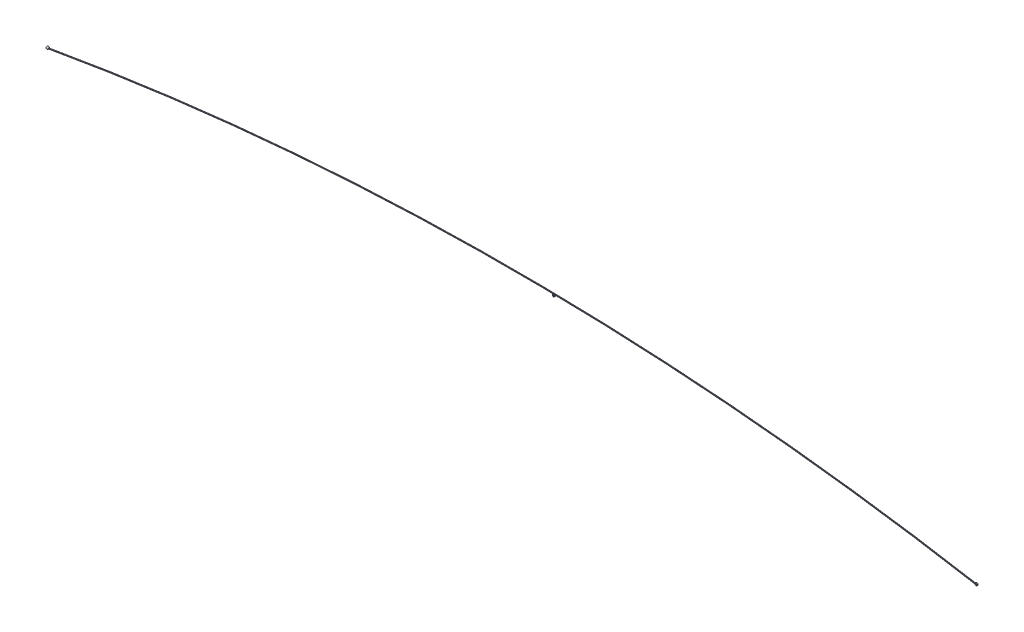
ISO-10303-21;
HEADER;
FILE_DESCRIPTION(('STEP AP214'),'2;1');
FILE_NAME('part.step','',(''),(''),'','','');
FILE_SCHEMA(('AUTOMOTIVE_DESIGN { 1 0 10303 214 1 1 1 1 }'));
ENDSEC;
DATA;
#1=APPLICATION_CONTEXT('core data for automotive mechanical design processes');
#2=APPLICATION_PROTOCOL_DEFINITION('international standard','automotive_design',2000,#1);
#3=PRODUCT_CONTEXT('',#1,'mechanical');
#4=PRODUCT('Part','Part','',(#3));
#5=PRODUCT_RELATED_PRODUCT_CATEGORY('part','',(#4));
#6=PRODUCT_DEFINITION_FORMATION('','',#4);
#7=PRODUCT_DEFINITION_CONTEXT('part definition',#1,'design');
#8=PRODUCT_DEFINITION('design','',#6,#7);
#9=PRODUCT_DEFINITION_SHAPE('','',#8);
#10=(LENGTH_UNIT() NAMED_UNIT(*) SI_UNIT(.MILLI.,.METRE.));
#11=(NAMED_UNIT(*) PLANE_ANGLE_UNIT() SI_UNIT($,.RADIAN.));
#12=(NAMED_UNIT(*) SI_UNIT($,.STERADIAN.) SOLID_ANGLE_UNIT());
#13=UNCERTAINTY_MEASURE_WITH_UNIT(LENGTH_MEASURE(1.E-05),#10,'distance_accuracy_value','');
#14=(GEOMETRIC_REPRESENTATION_CONTEXT(3) GLOBAL_UNCERTAINTY_ASSIGNED_CONTEXT((#13)) GLOBAL_UNIT_ASSIGNED_CONTEXT((#10,
#11,#12)) REPRESENTATION_CONTEXT('',''));
#15=CARTESIAN_POINT('',(0.,0.,0.));
#16=DIRECTION('',(0.,0.,1.));
#17=DIRECTION('',(1.,0.,0.));
#18=AXIS2_PLACEMENT_3D('',#15,#16,#17);
#19=CARTESIAN_POINT('',(-980.499968128505,0.249999999999931,0.));
#20=DIRECTION('',(-1.,0.,0.));
#21=DIRECTION('',(0.,1.,0.));
#22=AXIS2_PLACEMENT_3D('',#19,#20,#21);
#23=SPHERICAL_SURFACE('',#22,1.24999999999997);
#24=CARTESIAN_POINT('',(-979.333313507256,0.367970312867591,-0.433012701892127));
#25=CARTESIAN_POINT('',(-979.32279340934,0.389589827164613,-0.398787143895514));
#26=CARTESIAN_POINT('',(-979.314304843821,0.411198311139304,-0.363958308396999));
#27=CARTESIAN_POINT('',(-979.304664654527,0.443432433607916,-0.311077125512851));
#28=CARTESIAN_POINT('',(-979.301967253967,0.454142287172078,-0.293352384484927));
#29=CARTESIAN_POINT('',(-979.297607372539,0.475480770262388,-0.257726621940905));
#30=CARTESIAN_POINT('',(-979.295944891672,0.486109399788469,-0.239825600424665));
#31=CARTESIAN_POINT('',(-979.293659045764,0.507257910557459,-0.203893687296926));
#32=CARTESIAN_POINT('',(-979.293035680725,0.5177777918003,-0.185862795685349));
#33=CARTESIAN_POINT('',(-979.29282960963,0.538682180211832,-0.149716803664039));
#34=CARTESIAN_POINT('',(-979.293246903576,0.549066687380468,-0.131601703254272));
#35=CARTESIAN_POINT('',(-979.295159747355,0.570096808926977,-0.0945890319726686));
#36=CARTESIAN_POINT('',(-979.296698835523,0.580735654625824,-0.0756898523962937));
#37=CARTESIAN_POINT('',(-979.300904814248,0.601837993104418,-0.0378498560237225));
#38=CARTESIAN_POINT('',(-979.303574814279,0.612300919096736,-0.0189090687503537));
#39=CARTESIAN_POINT('',(-979.30680645399,0.622646237693473,0.));
#40=B_SPLINE_CURVE_WITH_KNOTS('',3,(#24,#25,#26,#27,#28,#29,#30,#31,#32,#33,#34,#35,#36,#37,#38,
#39),.UNSPECIFIED.,.F.,.F.,(4,2,2,2,2,2,2,4),(0.,0.125375075757954,0.188002652741953,
0.250630229776885,0.313257806850441,0.375885383949944,0.441082570118055,0.506460193592486),.UNSPECIFIED.);
#41=CARTESIAN_POINT('',(-979.333313507339,0.367970312853405,-0.433012701892219));
#42=VERTEX_POINT('',#41);
#43=CARTESIAN_POINT('',(-979.30680645399,0.622646237694236,0.));
#44=VERTEX_POINT('',#43);
#45=EDGE_CURVE('E218',#42,#44,#40,.T.);
#46=ORIENTED_EDGE('',*,*,#45,.F.);
#47=CARTESIAN_POINT('',(-980.499968128505,0.249999999999931,-0.433012701892219));
#48=DIRECTION('',(0.,0.,-1.));
#49=DIRECTION('',(-1.,0.,0.));
#50=AXIS2_PLACEMENT_3D('',#47,#48,#49);
#51=CIRCLE('',#50,1.17260393995583);
#52=CARTESIAN_POINT('',(-979.395164077457,-0.14294784519242,-0.433012701892219));
#53=VERTEX_POINT('',#52);
#54=EDGE_CURVE('E242',#53,#42,#51,.F.);
#55=ORIENTED_EDGE('',*,*,#54,.F.);
#56=CARTESIAN_POINT('',(-979.431919833581,-0.399440405049869,0.));
#57=CARTESIAN_POINT('',(-979.418784027979,-0.377846039543982,-0.0333787127993528));
#58=CARTESIAN_POINT('',(-979.408078854718,-0.356181057389514,-0.0676247826045807));
#59=CARTESIAN_POINT('',(-979.395752866956,-0.323817842424912,-0.119904948382628));
#60=CARTESIAN_POINT('',(-979.392267316339,-0.313060046315681,-0.137470761167597));
#61=CARTESIAN_POINT('',(-979.386547977937,-0.291621345049526,-0.172852767543568));
#62=CARTESIAN_POINT('',(-979.384314190142,-0.280940439891928,-0.190668961132376));
#63=CARTESIAN_POINT('',(-979.381106702527,-0.259696282307874,-0.22648364754626));
#64=CARTESIAN_POINT('',(-979.380133002699,-0.24913302988064,-0.244482140370132));
#65=CARTESIAN_POINT('',(-979.379449236784,-0.228163617700767,-0.280594176728098));
#66=CARTESIAN_POINT('',(-979.379739170692,-0.217757457947446,-0.298707720261691));
#67=CARTESIAN_POINT('',(-979.381642123985,-0.19646829344001,-0.336166116757573));
#68=CARTESIAN_POINT('',(-979.383340240212,-0.185598479373851,-0.355514193182297));
#69=CARTESIAN_POINT('',(-979.388171469161,-0.164081343464385,-0.394264606673515));
#70=CARTESIAN_POINT('',(-979.391310695887,-0.153435173744305,-0.413666821288893));
#71=CARTESIAN_POINT('',(-979.39516407758,-0.142947845214247,-0.43301270189222));
#72=B_SPLINE_CURVE_WITH_KNOTS('',3,(#56,#57,#58,#59,#60,#61,#62,#63,#64,#65,#66,#67,#68,#69,#70,
#71),.UNSPECIFIED.,.F.,.F.,(4,2,2,2,2,2,2,4),(0.,0.125451214406272,0.188088228690081,
0.250725242424663,0.313362255745273,0.375999268793365,0.442723343297771,0.509733153079345),.UNSPECIFIED.);
#73=CARTESIAN_POINT('',(-979.431919833581,-0.399440405049869,0.));
#74=VERTEX_POINT('',#73);
#75=EDGE_CURVE('E251',#74,#53,#72,.T.);
#76=ORIENTED_EDGE('',*,*,#75,.F.);
#77=CARTESIAN_POINT('',(-979.395164077581,-0.142947845214393,0.433012701892376));
#78=CARTESIAN_POINT('',(-979.391562426821,-0.15275073509811,0.414929474145294));
#79=CARTESIAN_POINT('',(-979.388584493591,-0.162692203524021,0.396797302588093));
#80=CARTESIAN_POINT('',(-979.383883510527,-0.182814373767124,0.36050304081111));
#81=CARTESIAN_POINT('',(-979.38216046069,-0.192995075583975,0.34234095059137));
#82=CARTESIAN_POINT('',(-979.379976692739,-0.213557788953609,0.306054820378091));
#83=CARTESIAN_POINT('',(-979.379515974626,-0.223939800506578,0.287930780384586));
#84=CARTESIAN_POINT('',(-979.379858325292,-0.244866094150746,0.251788827287639));
#85=CARTESIAN_POINT('',(-979.380661394077,-0.255410376242474,0.233770914184543));
#86=CARTESIAN_POINT('',(-979.383563319151,-0.276880386555465,0.197471400132062));
#87=CARTESIAN_POINT('',(-979.385693251004,-0.287809151121964,0.179194061265383));
#88=CARTESIAN_POINT('',(-979.391267848337,-0.309751958148249,0.142894528729484));
#89=CARTESIAN_POINT('',(-979.394712513829,-0.320766000608752,0.124872335062407));
#90=CARTESIAN_POINT('',(-979.407159242011,-0.354310977503485,0.0705821988423279));
#91=CARTESIAN_POINT('',(-979.418216198227,-0.376913433045617,0.034820095762965));
#92=CARTESIAN_POINT('',(-979.431919833584,-0.399440405051695,0.));
#93=B_SPLINE_CURVE_WITH_KNOTS('',3,(#77,#78,#79,#80,#81,#82,#83,#84,#85,#86,#87,#88,#89,#90,#91,
#92),.UNSPECIFIED.,.F.,.F.,(4,2,2,2,2,2,2,4),(0.,0.062637013001778,0.12527402591406,
0.187911038884388,0.25054805205944,0.314710241366923,0.378872431213442,0.509725306650627),.UNSPECIFIED.);
#94=CARTESIAN_POINT('',(-979.395164077581,-0.142947845214393,0.433012701892376));
#95=VERTEX_POINT('',#94);
#96=EDGE_CURVE('E253',#95,#74,#93,.T.);
#97=ORIENTED_EDGE('',*,*,#96,.F.);
#98=CARTESIAN_POINT('',(-980.499968128505,0.249999999999931,0.433012701892219));
#99=DIRECTION('',(0.,0.,1.));
#100=DIRECTION('',(1.,0.,0.));
#101=AXIS2_PLACEMENT_3D('',#98,#99,#100);
#102=CIRCLE('',#101,1.17260393995583);
#103=CARTESIAN_POINT('',(-979.333313507339,0.367970312853405,0.433012701892219));
#104=VERTEX_POINT('',#103);
#105=EDGE_CURVE('E255',#104,#95,#102,.F.);
#106=ORIENTED_EDGE('',*,*,#105,.F.);
#107=CARTESIAN_POINT('',(-979.30680645399,0.622646237694236,0.));
#108=CARTESIAN_POINT('',(-979.303710845033,0.612736121907413,0.0181135840697497));
#109=CARTESIAN_POINT('',(-979.301130526154,0.602718169004803,0.0362561568588424));
#110=CARTESIAN_POINT('',(-979.297004951607,0.582492417162171,0.0725531690273767));
#111=CARTESIAN_POINT('',(-979.295459695938,0.572284618222132,0.0907076084068194));
#112=CARTESIAN_POINT('',(-979.293408730865,0.551705002501813,0.126982242902313));
#113=CARTESIAN_POINT('',(-979.29290302146,0.541333185721551,0.145102438018369));
#114=CARTESIAN_POINT('',(-979.292932283582,0.520451975425859,0.181262428989015));
#115=CARTESIAN_POINT('',(-979.293467255108,0.509942581910475,0.199302224843631));
#116=CARTESIAN_POINT('',(-979.295592485336,0.488653156345019,0.235527410291851));
#117=CARTESIAN_POINT('',(-979.297198557324,0.477871433919119,0.253710884932842));
#118=CARTESIAN_POINT('',(-979.301477523962,0.456222370843983,0.289899395638271));
#119=CARTESIAN_POINT('',(-979.304150418612,0.445355030194813,0.307904431702847));
#120=CARTESIAN_POINT('',(-979.313841836668,0.412380660768063,0.36205213396971));
#121=CARTESIAN_POINT('',(-979.322505273682,0.390181592358491,0.397850383400429));
#122=CARTESIAN_POINT('',(-979.333313507257,0.36797031286782,0.433012701892219));
#123=B_SPLINE_CURVE_WITH_KNOTS('',3,(#107,#108,#109,#110,#111,#112,#113,#114,#115,#116,#117,
#118,#119,#120,#121,#122),.UNSPECIFIED.,.F.,.F.,(4,2,2,2,2,2,2,4),(0.,0.0626275771084987,
0.125255154222541,0.187882731329055,0.250510308415016,0.314083587676855,0.377656866889839,
0.5064568576761),.UNSPECIFIED.);
#124=EDGE_CURVE('E227',#44,#104,#123,.T.);
#125=ORIENTED_EDGE('',*,*,#124,.F.);
#126=EDGE_LOOP('',(#46,#55,#76,#97,#106,#125));
#127=FACE_BOUND('',#126,.T.);
#128=ADVANCED_FACE('F38',(#127),#23,.T.);
#129=CARTESIAN_POINT('',(-980.085852788761,0.23479629183987,-0.433012701892219));
#130=CARTESIAN_POINT('',(-655.077119848966,57.7959357665741,-0.433012701892219));
#131=CARTESIAN_POINT('',(-325.010518632569,57.8010559672835,-0.433012701892219));
#132=CARTESIAN_POINT('',(2.22044604925031E-13,0.250000000000195,-0.433012701892219));
#133=CARTESIAN_POINT('',(-980.171705577522,0.469592583680145,0.));
#134=CARTESIAN_POINT('',(-655.135395546844,58.0408155658653,0.));
#135=CARTESIAN_POINT('',(-325.039881416226,58.0510559672835,0.));
#136=CARTESIAN_POINT('',(1.11022302462516E-13,0.500000000000222,0.));
#137=(BOUNDED_SURFACE() B_SPLINE_SURFACE(1,3,((#129,#130,#131,#132),(#133,#134,#135,#136)),
.UNSPECIFIED.,.F.,.F.,.F.) B_SPLINE_SURFACE_WITH_KNOTS((2,2),(4,4),(0.,1.),(0.,1.),
.UNSPECIFIED.) GEOMETRIC_REPRESENTATION_ITEM() RATIONAL_B_SPLINE_SURFACE(((1.,0.98978594943853,
0.98978594943853,1.),(1.,0.98978594943853,0.98978594943853,1.))) REPRESENTATION_ITEM('') SURFACE());
#138=CARTESIAN_POINT('',(-0.216300692091165,0.288292605556517,-0.433012701892219));
#139=CARTESIAN_POINT('',(-0.21391882597524,0.298341394989262,-0.41487724666311));
#140=CARTESIAN_POINT('',(-0.211411255665442,0.308366116119425,-0.396744945766788));
#141=CARTESIAN_POINT('',(-0.206143844494259,0.328365646628616,-0.360489461659237));
#142=CARTESIAN_POINT('',(-0.203384003590703,0.3383404559993,-0.342366278449533));
#143=CARTESIAN_POINT('',(-0.197611189220388,0.358238386700885,-0.306131840760601));
#144=CARTESIAN_POINT('',(-0.194598215697193,0.368161508020261,-0.288020586284035));
#145=CARTESIAN_POINT('',(-0.188317872977835,0.387954167213147,-0.251812899972676));
#146=CARTESIAN_POINT('',(-0.185050503710147,0.397823705071591,-0.233716468142053));
#147=CARTESIAN_POINT('',(-0.178259781483699,0.417507206826605,-0.197541385770555));
#148=CARTESIAN_POINT('',(-0.174736428437274,0.427321170704143,-0.179462735235772));
#149=CARTESIAN_POINT('',(-0.167431880721843,0.4468913958786,-0.143326330204861));
#150=CARTESIAN_POINT('',(-0.163650685947738,0.456647657151998,-0.125268575717253));
#151=CARTESIAN_POINT('',(-0.151981568002994,0.485665106687137,-0.0714308340158127));
#152=CARTESIAN_POINT('',(-0.14371177866576,0.504838428891596,-0.0356859599875362));
#153=CARTESIAN_POINT('',(-0.134920305853428,0.523885387619836,0.));
#154=B_SPLINE_CURVE_WITH_KNOTS('',3,(#138,#139,#140,#141,#142,#143,#144,#145,#146,#147,#148,
#149,#150,#151,#152,#153),.UNSPECIFIED.,.F.,.F.,(4,2,2,2,2,2,2,4),(0.,0.0626088618955963,
0.125217734257266,0.187826620577726,0.250435524501083,0.313044449865433,0.375653400749815,
0.499831796241539),.UNSPECIFIED.);
#155=CARTESIAN_POINT('',(-0.216300691858573,0.288292605515217,-0.433012701892219));
#156=VERTEX_POINT('',#155);
#157=CARTESIAN_POINT('',(-0.134920305853603,0.523885387619494,0.));
#158=VERTEX_POINT('',#157);
#159=EDGE_CURVE('E192',#156,#158,#154,.T.);
#160=CARTESIAN_POINT('',(-490.,-2766.9477768834,-0.433012701892219));
#161=DIRECTION('',(0.,0.,-1.));
#162=DIRECTION('',(-0.174392499137077,0.984676218990143,0.));
#163=AXIS2_PLACEMENT_3D('',#160,#161,#162);
#164=CIRCLE('',#163,2810.24617006917);
#165=EDGE_CURVE('E226',#42,#156,#164,.T.);
#166=CARTESIAN_POINT('',(-490.,-2766.9477768834,0.));
#167=DIRECTION('',(0.,0.,-1.));
#168=DIRECTION('',(-0.174407771357053,0.984673514059491,0.));
#169=AXIS2_PLACEMENT_3D('',#166,#167,#168);
#170=CIRCLE('',#169,2810.49234081449);
#171=EDGE_CURVE('E233',#44,#158,#170,.T.);
#172=ORIENTED_EDGE('',*,*,#159,.F.);
#173=ORIENTED_EDGE('',*,*,#165,.F.);
#174=ORIENTED_EDGE('',*,*,#45,.T.);
#175=ORIENTED_EDGE('',*,*,#171,.T.);
#176=EDGE_LOOP('',(#172,#173,#174,#175));
#177=FACE_BOUND('',#176,.T.);
#178=ADVANCED_FACE('F200',(#177),#137,.T.);
#179=CARTESIAN_POINT('',(-980.171705577522,0.469592583680145,0.));
#180=CARTESIAN_POINT('',(-655.135395546844,58.0408155658653,0.));
#181=CARTESIAN_POINT('',(-325.039881416226,58.0510559672835,0.));
#182=CARTESIAN_POINT('',(1.11022302462516E-13,0.500000000000222,0.));
#183=CARTESIAN_POINT('',(-980.085852788761,0.23479629183987,0.433012701892219));
#184=CARTESIAN_POINT('',(-655.077119848966,57.7959357665741,0.433012701892219));
#185=CARTESIAN_POINT('',(-325.010518632569,57.8010559672835,0.433012701892219));
#186=CARTESIAN_POINT('',(2.22044604925031E-13,0.250000000000195,0.433012701892219));
#187=(BOUNDED_SURFACE() B_SPLINE_SURFACE(1,3,((#179,#180,#181,#182),(#183,#184,#185,#186)),
.UNSPECIFIED.,.F.,.F.,.F.) B_SPLINE_SURFACE_WITH_KNOTS((2,2),(4,4),(0.,1.),(0.,1.),
.UNSPECIFIED.) GEOMETRIC_REPRESENTATION_ITEM() RATIONAL_B_SPLINE_SURFACE(((1.,0.98978594943853,
0.98978594943853,1.),(1.,0.98978594943853,0.98978594943853,1.))) REPRESENTATION_ITEM('') SURFACE());
#188=CARTESIAN_POINT('',(-0.134920305853437,0.523885387619938,0.));
#189=CARTESIAN_POINT('',(-0.143785893550072,0.504677865703067,0.0359867888359038));
#190=CARTESIAN_POINT('',(-0.152121059764235,0.485341596715225,0.0720339410699167));
#191=CARTESIAN_POINT('',(-0.163842595286272,0.456158304513642,0.126175003745159));
#192=CARTESIAN_POINT('',(-0.167619461549544,0.446401045354904,0.144233159583827));
#193=CARTESIAN_POINT('',(-0.173091351771874,0.431722057591774,0.171335748683387));
#194=CARTESIAN_POINT('',(-0.174883067234592,0.426821916486979,0.180372434466379));
#195=CARTESIAN_POINT('',(-0.180161959062576,0.412100080499995,0.20749007092345));
#196=CARTESIAN_POINT('',(-0.183552824914396,0.402257117535038,0.225578333111946));
#197=CARTESIAN_POINT('',(-0.190079428234216,0.382516688610982,0.261771047205208));
#198=CARTESIAN_POINT('',(-0.193215165786651,0.372619222669921,0.279875499104615));
#199=CARTESIAN_POINT('',(-0.19923295176458,0.352771709742254,0.316097706937327));
#200=CARTESIAN_POINT('',(-0.202115000258638,0.342821662769861,0.334215462867035));
#201=CARTESIAN_POINT('',(-0.208958131334887,0.318049963942574,0.379219754773168));
#202=CARTESIAN_POINT('',(-0.212767588096373,0.303197812043211,0.406112638002045));
#203=CARTESIAN_POINT('',(-0.216300692091063,0.288292605557125,0.433012701892219));
#204=B_SPLINE_CURVE_WITH_KNOTS('',3,(#188,#189,#190,#191,#192,#193,#194,#195,#196,#197,#198,
#199,#200,#201,#202,#203),.UNSPECIFIED.,.F.,.F.,(4,2,2,2,2,2,2,4),(0.,0.125226050419562,
0.187835010278728,0.219139006984673,0.281747928118828,0.344356828532528,0.40696571202492,
0.499831169010449),.UNSPECIFIED.);
#205=CARTESIAN_POINT('',(-0.216300691858573,0.288292605515217,0.433012701892219));
#206=VERTEX_POINT('',#205);
#207=EDGE_CURVE('E64',#158,#206,#204,.T.);
#208=CARTESIAN_POINT('',(-490.,-2766.9477768834,0.433012701892219));
#209=DIRECTION('',(0.,0.,-1.));
#210=DIRECTION('',(-0.174392499137077,0.984676218990143,0.));
#211=AXIS2_PLACEMENT_3D('',#208,#209,#210);
#212=CIRCLE('',#211,2810.24617006917);
#213=EDGE_CURVE('E235',#104,#206,#212,.T.);
#214=ORIENTED_EDGE('',*,*,#207,.F.);
#215=ORIENTED_EDGE('',*,*,#171,.F.);
#216=ORIENTED_EDGE('',*,*,#124,.T.);
#217=ORIENTED_EDGE('',*,*,#213,.T.);
#218=EDGE_LOOP('',(#214,#215,#216,#217));
#219=FACE_BOUND('',#218,.T.);
#220=ADVANCED_FACE('F206',(#219),#187,.T.);
#221=CARTESIAN_POINT('',(-979.914147211239,-0.234796291840682,0.433012701892219));
#222=CARTESIAN_POINT('',(-654.96056845321,57.3061761679918,0.433012701892219));
#223=CARTESIAN_POINT('',(-324.951793065255,57.3010559672835,0.433012701892219));
#224=CARTESIAN_POINT('',(1.11022302462516E-13,-0.249999999999806,0.433012701892219));
#225=CARTESIAN_POINT('',(-979.828294422478,-0.469592583680957,0.));
#226=CARTESIAN_POINT('',(-654.902292755331,57.0612963687006,0.));
#227=CARTESIAN_POINT('',(-324.922430281598,57.0510559672835,0.));
#228=CARTESIAN_POINT('',(1.11022302462516E-13,-0.499999999999834,0.));
#229=(BOUNDED_SURFACE() B_SPLINE_SURFACE(1,3,((#221,#222,#223,#224),(#225,#226,#227,#228)),
.UNSPECIFIED.,.F.,.F.,.F.) B_SPLINE_SURFACE_WITH_KNOTS((2,2),(4,4),(0.,1.),(0.,1.),
.UNSPECIFIED.) GEOMETRIC_REPRESENTATION_ITEM() RATIONAL_B_SPLINE_SURFACE(((1.,0.98978594943853,
0.98978594943853,1.),(1.,0.98978594943853,0.98978594943853,1.))) REPRESENTATION_ITEM('') SURFACE());
#230=CARTESIAN_POINT('',(-444.682558537927,42.1943753976901,0.));
#231=CARTESIAN_POINT('',(-444.705462076301,42.211807053072,0.030008645347709));
#232=CARTESIAN_POINT('',(-444.729517043246,42.2288953146537,0.0593811356851823));
#233=CARTESIAN_POINT('',(-444.780573997614,42.2623602500474,0.116792332420969));
#234=CARTESIAN_POINT('',(-444.807613732769,42.2787229735588,0.144805451924142));
#235=CARTESIAN_POINT('',(-444.878589576154,42.3178899039398,0.211684608819008));
#236=CARTESIAN_POINT('',(-444.924318109252,42.3399271887806,0.249152040409667));
#237=CARTESIAN_POINT('',(-445.022814067818,42.3795033808737,0.315981424947008));
#238=CARTESIAN_POINT('',(-445.075522921524,42.3970765090899,0.345405179878039));
#239=CARTESIAN_POINT('',(-445.156819867998,42.4177816435258,0.37953739240956));
#240=CARTESIAN_POINT('',(-445.182785866517,42.4235484425816,0.388951164423665));
#241=CARTESIAN_POINT('',(-445.235845021399,42.4335104790458,0.404984399195873));
#242=CARTESIAN_POINT('',(-445.262937127484,42.4377071458705,0.411606404221794));
#243=CARTESIAN_POINT('',(-445.32481441808,42.445161621795,0.422985274553262));
#244=CARTESIAN_POINT('',(-445.359829589363,42.4479224111886,0.426861956439701));
#245=CARTESIAN_POINT('',(-445.430152305745,42.4504564113294,0.429354998971146));
#246=CARTESIAN_POINT('',(-445.465459832865,42.4502298044403,0.427971680713173));
#247=CARTESIAN_POINT('',(-445.535236142987,42.4468549932583,0.420092258134075));
#248=CARTESIAN_POINT('',(-445.569707102659,42.4437154543842,0.413611326944667));
#249=CARTESIAN_POINT('',(-445.637123412766,42.4348288403176,0.396107901879271));
#250=CARTESIAN_POINT('',(-445.6700673052,42.4290793274983,0.385081163260303));
#251=CARTESIAN_POINT('',(-445.747944987448,42.4123849434639,0.353559549079942));
#252=CARTESIAN_POINT('',(-445.791799373773,42.400267414818,0.331033171102876));
#253=CARTESIAN_POINT('',(-445.874901199745,42.3727269467834,0.280297460303724));
#254=CARTESIAN_POINT('',(-445.914140982234,42.3572986302378,0.252078887131558));
#255=CARTESIAN_POINT('',(-445.971355270489,42.3316576692889,0.205403964991624));
#256=CARTESIAN_POINT('',(-445.990882910429,42.322265300205,0.188346597744507));
#257=CARTESIAN_POINT('',(-446.02868150465,42.3029072649832,0.153258817320063));
#258=CARTESIAN_POINT('',(-446.046954378441,42.2929425193745,0.135229969273597));
#259=CARTESIAN_POINT('',(-446.082587471527,42.2723854589259,0.0980941811859726));
#260=CARTESIAN_POINT('',(-446.099931931561,42.2617864604745,0.0789759273108143));
#261=CARTESIAN_POINT('',(-446.133527030651,42.2401528433845,0.0400038182626065));
#262=CARTESIAN_POINT('',(-446.149776763107,42.2291178754078,0.0201493740041367));
#263=CARTESIAN_POINT('',(-446.16551034142,42.2179070411843,0.));
#264=B_SPLINE_CURVE_WITH_KNOTS('',3,(#230,#231,#232,#233,#234,#235,#236,#237,#238,#239,#240,
#241,#242,#243,#244,#245,#246,#247,#248,#249,#250,#251,#252,#253,#254,#255,#256,#257,#258,#259,
#260,#261,#262,#263),.UNSPECIFIED.,.F.,.F.,(4,2,2,2,2,2,2,2,2,2,2,2,2,2,2,2,4),(0.,
0.124759689676169,0.251332472318894,0.439854065616771,0.626883652251269,0.711356629258659,
0.795752515577973,0.90124775133661,1.0067365472357,1.11191253672049,1.21718695974427,
1.36863945878187,1.52033982395805,1.60302754572319,1.68558581797272,1.76926497342171,
1.85301259695889),.UNSPECIFIED.);
#265=CARTESIAN_POINT('',(-444.682558537927,42.1943753976901,0.));
#266=VERTEX_POINT('',#265);
#267=CARTESIAN_POINT('',(-446.16551034142,42.2179070411839,0.));
#268=VERTEX_POINT('',#267);
#269=EDGE_CURVE('E113',#266,#268,#264,.T.);
#270=CARTESIAN_POINT('',(-490.,-2766.9477768834,0.));
#271=DIRECTION('',(0.,0.,-1.));
#272=DIRECTION('',(-0.174346666167418,0.984684335204083,0.));
#273=AXIS2_PLACEMENT_3D('',#270,#271,#272);
#274=CIRCLE('',#273,2809.5076618908);
#275=CARTESIAN_POINT('',(-0.15741057440205,-0.47212367263505,0.));
#276=VERTEX_POINT('',#275);
#277=EDGE_CURVE('E101',#266,#276,#274,.T.);
#278=CARTESIAN_POINT('',(-0.232429987297555,-0.208845221180365,0.433012701892219));
#279=CARTESIAN_POINT('',(-0.228824415570647,-0.230116294286465,0.397275086632627));
#280=CARTESIAN_POINT('',(-0.224646094285916,-0.251437716705511,0.361625909075061));
#281=CARTESIAN_POINT('',(-0.217479461041349,-0.283484979636258,0.308315120169677));
#282=CARTESIAN_POINT('',(-0.214940834617128,-0.294177861111193,0.290572669518828));
#283=CARTESIAN_POINT('',(-0.209557147422459,-0.315584006412122,0.25514646009062));
#284=CARTESIAN_POINT('',(-0.206712086218662,-0.326297270266919,0.237462701396297));
#285=CARTESIAN_POINT('',(-0.20070786448942,-0.347742180309034,0.202159698706675));
#286=CARTESIAN_POINT('',(-0.197548703460801,-0.358473826525772,0.184540454814771));
#287=CARTESIAN_POINT('',(-0.190907964013171,-0.379953385593746,0.149372705942761));
#288=CARTESIAN_POINT('',(-0.187426385008229,-0.390701298474508,0.13182420109127));
#289=CARTESIAN_POINT('',(-0.179790419551743,-0.413217689121148,0.0951658754414891));
#290=CARTESIAN_POINT('',(-0.175603560487546,-0.424987538655277,0.0760636416937874));
#291=CARTESIAN_POINT('',(-0.166818638923499,-0.4485445097618,0.0379554329346463));
#292=CARTESIAN_POINT('',(-0.162220437536659,-0.460331635836134,0.0189494927421928));
#293=CARTESIAN_POINT('',(-0.157410574402227,-0.472123672634369,0.));
#294=B_SPLINE_CURVE_WITH_KNOTS('',3,(#278,#279,#280,#281,#282,#283,#284,#285,#286,#287,#288,
#289,#290,#291,#292,#293),.UNSPECIFIED.,.F.,.F.,(4,2,2,2,2,2,2,4),(0.,0.125227967167835,
0.187837346496533,0.250446814366163,0.313056382534742,0.375666064485921,0.444135448693806,
0.512628039023825),.UNSPECIFIED.);
#295=CARTESIAN_POINT('',(-0.232429988135663,-0.208845221032483,0.433012701892219));
#296=VERTEX_POINT('',#295);
#297=EDGE_CURVE('E186',#296,#276,#294,.T.);
#298=CARTESIAN_POINT('',(-490.,-2766.9477768834,0.433012701892219));
#299=DIRECTION('',(0.,0.,-1.));
#300=DIRECTION('',(-0.174361946542974,0.984681629562441,0.));
#301=AXIS2_PLACEMENT_3D('',#298,#299,#300);
#302=CIRCLE('',#301,2809.75383060715);
#303=EDGE_CURVE('E110',#95,#296,#302,.T.);
#304=EDGE_CURVE('E109',#74,#268,#274,.T.);
#305=ORIENTED_EDGE('',*,*,#269,.F.);
#306=ORIENTED_EDGE('',*,*,#277,.T.);
#307=ORIENTED_EDGE('',*,*,#297,.F.);
#308=ORIENTED_EDGE('',*,*,#303,.F.);
#309=ORIENTED_EDGE('',*,*,#96,.T.);
#310=ORIENTED_EDGE('',*,*,#304,.T.);
#311=EDGE_LOOP('',(#305,#306,#307,#308,#309,#310));
#312=FACE_BOUND('',#311,.T.);
#313=ADVANCED_FACE('F114',(#312),#229,.T.);
#314=CARTESIAN_POINT('',(-979.828294422478,-0.469592583680957,0.));
#315=CARTESIAN_POINT('',(-654.902292755331,57.0612963687006,0.));
#316=CARTESIAN_POINT('',(-324.922430281598,57.0510559672835,0.));
#317=CARTESIAN_POINT('',(1.11022302462516E-13,-0.499999999999834,0.));
#318=CARTESIAN_POINT('',(-979.914147211239,-0.234796291840681,-0.43301270189222));
#319=CARTESIAN_POINT('',(-654.96056845321,57.3061761679918,-0.43301270189222));
#320=CARTESIAN_POINT('',(-324.951793065255,57.3010559672835,-0.43301270189222));
#321=CARTESIAN_POINT('',(1.11022302462516E-13,-0.249999999999806,-0.43301270189222));
#322=(BOUNDED_SURFACE() B_SPLINE_SURFACE(1,3,((#314,#315,#316,#317),(#318,#319,#320,#321)),
.UNSPECIFIED.,.F.,.F.,.F.) B_SPLINE_SURFACE_WITH_KNOTS((2,2),(4,4),(0.,1.),(0.,1.),
.UNSPECIFIED.) GEOMETRIC_REPRESENTATION_ITEM() RATIONAL_B_SPLINE_SURFACE(((1.,0.98978594943853,
0.98978594943853,1.),(1.,0.98978594943853,0.98978594943853,1.))) REPRESENTATION_ITEM('') SURFACE());
#323=CARTESIAN_POINT('',(-446.16551034142,42.2179070411839,0.));
#324=CARTESIAN_POINT('',(-446.142065258609,42.2346032315105,-0.0300086453477279));
#325=CARTESIAN_POINT('',(-446.117480222213,42.250919668131,-0.059381135685186));
#326=CARTESIAN_POINT('',(-446.065387190091,42.2827478081126,-0.116792332420944));
#327=CARTESIAN_POINT('',(-446.037841908258,42.2982443705277,-0.144805451924103));
#328=CARTESIAN_POINT('',(-445.965659101403,42.3351396435881,-0.211684608818975));
#329=CARTESIAN_POINT('',(-445.919254387021,42.3557149478516,-0.249152040409689));
#330=CARTESIAN_POINT('',(-445.819552335307,42.392146111962,-0.315981424947049));
#331=CARTESIAN_POINT('',(-445.766312454477,42.408038033922,-0.345405179878052));
#332=CARTESIAN_POINT('',(-445.684399501023,42.426153335586,-0.379537392409543));
#333=CARTESIAN_POINT('',(-445.658263605189,42.4310933760105,-0.388951164423644));
#334=CARTESIAN_POINT('',(-445.604915086037,42.4393669237157,-0.404984399195858));
#335=CARTESIAN_POINT('',(-445.577703467117,42.4427018930165,-0.411606404221793));
#336=CARTESIAN_POINT('',(-445.515620812356,42.4481893587962,-0.422985274553278));
#337=CARTESIAN_POINT('',(-445.480535675092,42.4498377887284,-0.42686195643971));
#338=CARTESIAN_POINT('',(-445.410167964539,42.4501392975894,-0.429354998971133));
#339=CARTESIAN_POINT('',(-445.374885403433,42.4487925593605,-0.427971680713143));
#340=CARTESIAN_POINT('',(-445.305251300183,42.4432055682957,-0.420092258134035));
#341=CARTESIAN_POINT('',(-445.270897307524,42.438973907454,-0.413611326944634));
#342=CARTESIAN_POINT('',(-445.203796895869,42.4279527671451,-0.396107901879232));
#343=CARTESIAN_POINT('',(-445.17105201148,42.4211608975384,-0.38508116326025));
#344=CARTESIAN_POINT('',(-445.093743221381,42.4020039973699,-0.353559549079865));
#345=CARTESIAN_POINT('',(-445.050295382063,42.3885011473364,-0.331033171102794));
#346=CARTESIAN_POINT('',(-444.968109205499,42.3583378709674,-0.280297460303562));
#347=CARTESIAN_POINT('',(-444.929378692165,42.3416723131305,-0.252078887131318));
#348=CARTESIAN_POINT('',(-444.873006751792,42.314228953323,-0.205403964991339));
#349=CARTESIAN_POINT('',(-444.853786946646,42.3042217354882,-0.188346597744239));
#350=CARTESIAN_POINT('',(-444.816621579016,42.2836741638156,-0.153258817319874));
#351=CARTESIAN_POINT('',(-444.798674068781,42.2731346691408,-0.135229969273467));
#352=CARTESIAN_POINT('',(-444.763711154979,42.2514573834345,-0.0980941811858772));
#353=CARTESIAN_POINT('',(-444.746711714797,42.24031341217,-0.0789759273106948));
#354=CARTESIAN_POINT('',(-444.713819926167,42.2176247737805,-0.0400038182624918));
#355=CARTESIAN_POINT('',(-444.697928494946,42.2060797862581,-0.0201493740040514));
#356=CARTESIAN_POINT('',(-444.682558537927,42.1943753976905,0.));
#357=B_SPLINE_CURVE_WITH_KNOTS('',3,(#323,#324,#325,#326,#327,#328,#329,#330,#331,#332,#333,
#334,#335,#336,#337,#338,#339,#340,#341,#342,#343,#344,#345,#346,#347,#348,#349,#350,#351,#352,
#353,#354,#355,#356),.UNSPECIFIED.,.F.,.F.,(4,2,2,2,2,2,2,2,2,2,2,2,2,2,2,2,4),(0.,
0.124759689676185,0.251332472318976,0.439854065616868,0.626883652251266,0.711356629258691,
0.795752515577927,0.901247751336574,1.00673654723574,1.11191253672061,1.2171869597445,
1.36863945878217,1.52033982395851,1.60302754572356,1.68558581797308,1.76926497342194,
1.85301259695893),.UNSPECIFIED.);
#358=EDGE_CURVE('E11',#268,#266,#357,.T.);
#359=CARTESIAN_POINT('',(-490.,-2766.9477768834,-0.433012701892219));
#360=DIRECTION('',(0.,0.,-1.));
#361=DIRECTION('',(-0.174361946542974,0.984681629562441,0.));
#362=AXIS2_PLACEMENT_3D('',#359,#360,#361);
#363=CIRCLE('',#362,2809.75383060715);
#364=CARTESIAN_POINT('',(-0.232429988135663,-0.208845221032483,-0.433012701892219));
#365=VERTEX_POINT('',#364);
#366=EDGE_CURVE('E240',#53,#365,#363,.T.);
#367=CARTESIAN_POINT('',(-0.157410574402217,-0.472123672634606,0.));
#368=CARTESIAN_POINT('',(-0.166204728021167,-0.450560759852459,-0.0346513900957458));
#369=CARTESIAN_POINT('',(-0.174292454880505,-0.429016107550103,-0.0694879329347643));
#370=CARTESIAN_POINT('',(-0.185422369539738,-0.396741133514122,-0.12197732661947));
#371=CARTESIAN_POINT('',(-0.18896522073512,-0.385990424756121,-0.139511875691358));
#372=CARTESIAN_POINT('',(-0.195726971293868,-0.364504844567087,-0.174652928534797));
#373=CARTESIAN_POINT('',(-0.198945871286367,-0.353769973105339,-0.192259432166538));
#374=CARTESIAN_POINT('',(-0.205068054941413,-0.332318244621197,-0.227538058155845));
#375=CARTESIAN_POINT('',(-0.207971339143756,-0.321601387568025,-0.245210180401129));
#376=CARTESIAN_POINT('',(-0.21347004490148,-0.300187663182737,-0.280614236344177));
#377=CARTESIAN_POINT('',(-0.216065466921355,-0.289490795820486,-0.298346169951658));
#378=CARTESIAN_POINT('',(-0.221184384983485,-0.267118777448988,-0.335526580508705));
#379=CARTESIAN_POINT('',(-0.223678417639998,-0.255445760562028,-0.354980398055762));
#380=CARTESIAN_POINT('',(-0.228315590962645,-0.232125138625603,-0.393951636111659));
#381=CARTESIAN_POINT('',(-0.230458644640563,-0.220477540579698,-0.41346907116898));
#382=CARTESIAN_POINT('',(-0.232429987297524,-0.208845221180214,-0.433012701892132));
#383=B_SPLINE_CURVE_WITH_KNOTS('',3,(#367,#368,#369,#370,#371,#372,#373,#374,#375,#376,#377,
#378,#379,#380,#381,#382),.UNSPECIFIED.,.F.,.F.,(4,2,2,2,2,2,2,4),(0.,0.125233852389943,
0.187843599578747,0.250453225173265,0.313062743685066,0.375672167732225,0.444141017315906,
0.512626810931999),.UNSPECIFIED.);
#384=EDGE_CURVE('E106',#276,#365,#383,.T.);
#385=ORIENTED_EDGE('',*,*,#358,.F.);
#386=ORIENTED_EDGE('',*,*,#304,.F.);
#387=ORIENTED_EDGE('',*,*,#75,.T.);
#388=ORIENTED_EDGE('',*,*,#366,.T.);
#389=ORIENTED_EDGE('',*,*,#384,.F.);
#390=ORIENTED_EDGE('',*,*,#277,.F.);
#391=EDGE_LOOP('',(#385,#386,#387,#388,#389,#390));
#392=FACE_BOUND('',#391,.T.);
#393=ADVANCED_FACE('F103',(#392),#322,.T.);
#394=CARTESIAN_POINT('',(-980.085852788761,0.23479629183987,0.433012701892219));
#395=DIRECTION('',(0.,0.,1.));
#396=DIRECTION('',(1.,0.,0.));
#397=AXIS2_PLACEMENT_3D('',#394,#395,#396);
#398=PLANE('',#397);
#399=CARTESIAN_POINT('',(1.,0.,0.433012701892219));
#400=DIRECTION('',(0.,0.,1.));
#401=DIRECTION('',(1.,0.,0.));
#402=AXIS2_PLACEMENT_3D('',#399,#400,#401);
#403=CIRCLE('',#402,1.25);
#404=EDGE_CURVE('E199',#206,#296,#403,.T.);
#405=ORIENTED_EDGE('',*,*,#404,.F.);
#406=ORIENTED_EDGE('',*,*,#213,.F.);
#407=ORIENTED_EDGE('',*,*,#105,.T.);
#408=ORIENTED_EDGE('',*,*,#303,.T.);
#409=EDGE_LOOP('',(#405,#406,#407,#408));
#410=FACE_BOUND('',#409,.T.);
#411=ADVANCED_FACE('F172',(#410),#398,.T.);
#412=CARTESIAN_POINT('',(-979.914147211239,-0.234796291840682,-0.433012701892219));
#413=DIRECTION('',(0.,0.,-1.));
#414=DIRECTION('',(-1.,0.,0.));
#415=AXIS2_PLACEMENT_3D('',#412,#413,#414);
#416=PLANE('',#415);
#417=CARTESIAN_POINT('',(1.,0.,-0.433012701892219));
#418=DIRECTION('',(0.,0.,-1.));
#419=DIRECTION('',(-1.,0.,0.));
#420=AXIS2_PLACEMENT_3D('',#417,#418,#419);
#421=CIRCLE('',#420,1.25);
#422=EDGE_CURVE('E51',#365,#156,#421,.T.);
#423=ORIENTED_EDGE('',*,*,#422,.F.);
#424=ORIENTED_EDGE('',*,*,#366,.F.);
#425=ORIENTED_EDGE('',*,*,#54,.T.);
#426=ORIENTED_EDGE('',*,*,#165,.T.);
#427=EDGE_LOOP('',(#423,#424,#425,#426));
#428=FACE_BOUND('',#427,.T.);
#429=ADVANCED_FACE('F40',(#428),#416,.T.);
#430=CARTESIAN_POINT('',(1.,0.,-0.5));
#431=DIRECTION('',(0.,0.,1.));
#432=DIRECTION('',(1.,0.,0.));
#433=AXIS2_PLACEMENT_3D('',#430,#431,#432);
#434=CYLINDRICAL_SURFACE('',#433,1.25);
#435=ORIENTED_EDGE('',*,*,#159,.T.);
#436=ORIENTED_EDGE('',*,*,#207,.T.);
#437=ORIENTED_EDGE('',*,*,#404,.T.);
#438=ORIENTED_EDGE('',*,*,#297,.T.);
#439=ORIENTED_EDGE('',*,*,#384,.T.);
#440=ORIENTED_EDGE('',*,*,#422,.T.);
#441=EDGE_LOOP('',(#435,#436,#437,#438,#439,#440));
#442=FACE_BOUND('',#441,.T.);
#443=CARTESIAN_POINT('',(1.,0.,-0.5));
#444=DIRECTION('',(0.,0.,1.));
#445=DIRECTION('',(1.,0.,0.));
#446=AXIS2_PLACEMENT_3D('',#443,#444,#445);
#447=CIRCLE('',#446,1.25);
#448=CARTESIAN_POINT('',(2.25,0.,-0.5));
#449=VERTEX_POINT('',#448);
#450=EDGE_CURVE('E294',#449,#449,#447,.T.);
#451=ORIENTED_EDGE('',*,*,#450,.T.);
#452=EDGE_LOOP('',(#451));
#453=FACE_BOUND('',#452,.T.);
#454=CARTESIAN_POINT('',(1.,0.,0.5));
#455=DIRECTION('',(0.,0.,1.));
#456=DIRECTION('',(1.,0.,0.));
#457=AXIS2_PLACEMENT_3D('',#454,#455,#456);
#458=CIRCLE('',#457,1.25);
#459=CARTESIAN_POINT('',(2.25,0.,0.5));
#460=VERTEX_POINT('',#459);
#461=EDGE_CURVE('E299',#460,#460,#458,.T.);
#462=ORIENTED_EDGE('',*,*,#461,.F.);
#463=EDGE_LOOP('',(#462));
#464=FACE_BOUND('',#463,.T.);
#465=ADVANCED_FACE('F166',(#442,#453,#464),#434,.T.);
#466=CARTESIAN_POINT('',(1.,0.,-0.5));
#467=DIRECTION('',(0.,0.,1.));
#468=DIRECTION('',(1.,0.,0.));
#469=AXIS2_PLACEMENT_3D('',#466,#467,#468);
#470=PLANE('',#469);
#471=CARTESIAN_POINT('',(1.,0.,-0.5));
#472=DIRECTION('',(0.,0.,1.));
#473=DIRECTION('',(1.,0.,0.));
#474=AXIS2_PLACEMENT_3D('',#471,#472,#473);
#475=CIRCLE('',#474,0.75);
#476=CARTESIAN_POINT('',(1.75,0.,-0.5));
#477=VERTEX_POINT('',#476);
#478=EDGE_CURVE('E296',#477,#477,#475,.T.);
#479=ORIENTED_EDGE('',*,*,#478,.T.);
#480=EDGE_LOOP('',(#479));
#481=FACE_BOUND('',#480,.T.);
#482=ORIENTED_EDGE('',*,*,#450,.F.);
#483=EDGE_LOOP('',(#482));
#484=FACE_BOUND('',#483,.T.);
#485=ADVANCED_FACE('F162',(#481,#484),#470,.F.);
#486=CARTESIAN_POINT('',(1.,0.,-0.5));
#487=DIRECTION('',(0.,0.,1.));
#488=DIRECTION('',(1.,0.,0.));
#489=AXIS2_PLACEMENT_3D('',#486,#487,#488);
#490=CYLINDRICAL_SURFACE('',#489,0.75);
#491=ORIENTED_EDGE('',*,*,#478,.F.);
#492=EDGE_LOOP('',(#491));
#493=FACE_BOUND('',#492,.T.);
#494=CARTESIAN_POINT('',(1.,0.,0.5));
#495=DIRECTION('',(0.,0.,1.));
#496=DIRECTION('',(1.,0.,0.));
#497=AXIS2_PLACEMENT_3D('',#494,#495,#496);
#498=CIRCLE('',#497,0.75);
#499=CARTESIAN_POINT('',(1.75,0.,0.5));
#500=VERTEX_POINT('',#499);
#501=EDGE_CURVE('E117',#500,#500,#498,.T.);
#502=ORIENTED_EDGE('',*,*,#501,.T.);
#503=EDGE_LOOP('',(#502));
#504=FACE_BOUND('',#503,.T.);
#505=ADVANCED_FACE('F158',(#493,#504),#490,.F.);
#506=CARTESIAN_POINT('',(1.,0.,0.5));
#507=DIRECTION('',(0.,0.,1.));
#508=DIRECTION('',(1.,0.,0.));
#509=AXIS2_PLACEMENT_3D('',#506,#507,#508);
#510=PLANE('',#509);
#511=ORIENTED_EDGE('',*,*,#461,.T.);
#512=EDGE_LOOP('',(#511));
#513=FACE_BOUND('',#512,.T.);
#514=ORIENTED_EDGE('',*,*,#501,.F.);
#515=EDGE_LOOP('',(#514));
#516=FACE_BOUND('',#515,.T.);
#517=ADVANCED_FACE('F124',(#513,#516),#510,.T.);
#518=CARTESIAN_POINT('',(-445.44,41.2,-0.5));
#519=DIRECTION('',(0.,0.,1.));
#520=DIRECTION('',(1.,0.,0.));
#521=AXIS2_PLACEMENT_3D('',#518,#519,#520);
#522=CYLINDRICAL_SURFACE('',#521,1.24999999999996);
#523=ORIENTED_EDGE('',*,*,#358,.T.);
#524=ORIENTED_EDGE('',*,*,#269,.T.);
#525=EDGE_LOOP('',(#523,#524));
#526=FACE_BOUND('',#525,.T.);
#527=CARTESIAN_POINT('',(-445.44,41.2,-0.5));
#528=DIRECTION('',(0.,0.,1.));
#529=DIRECTION('',(1.,0.,0.));
#530=AXIS2_PLACEMENT_3D('',#527,#528,#529);
#531=CIRCLE('',#530,1.24999999999996);
#532=CARTESIAN_POINT('',(-444.19,41.2,-0.5));
#533=VERTEX_POINT('',#532);
#534=EDGE_CURVE('E118',#533,#533,#531,.T.);
#535=ORIENTED_EDGE('',*,*,#534,.T.);
#536=EDGE_LOOP('',(#535));
#537=FACE_BOUND('',#536,.T.);
#538=CARTESIAN_POINT('',(-445.44,41.2,0.5));
#539=DIRECTION('',(0.,0.,1.));
#540=DIRECTION('',(1.,0.,0.));
#541=AXIS2_PLACEMENT_3D('',#538,#539,#540);
#542=CIRCLE('',#541,1.24999999999996);
#543=CARTESIAN_POINT('',(-444.19,41.2,0.5));
#544=VERTEX_POINT('',#543);
#545=EDGE_CURVE('E130',#544,#544,#542,.T.);
#546=ORIENTED_EDGE('',*,*,#545,.F.);
#547=EDGE_LOOP('',(#546));
#548=FACE_BOUND('',#547,.T.);
#549=ADVANCED_FACE('F120',(#526,#537,#548),#522,.T.);
#550=CARTESIAN_POINT('',(-445.44,41.2,-0.5));
#551=DIRECTION('',(0.,0.,1.));
#552=DIRECTION('',(1.,0.,0.));
#553=AXIS2_PLACEMENT_3D('',#550,#551,#552);
#554=PLANE('',#553);
#555=CARTESIAN_POINT('',(-445.44,41.2,-0.5));
#556=DIRECTION('',(0.,0.,1.));
#557=DIRECTION('',(1.,0.,0.));
#558=AXIS2_PLACEMENT_3D('',#555,#556,#557);
#559=CIRCLE('',#558,0.749999999999983);
#560=CARTESIAN_POINT('',(-444.69,41.2,-0.5));
#561=VERTEX_POINT('',#560);
#562=EDGE_CURVE('E132',#561,#561,#559,.T.);
#563=ORIENTED_EDGE('',*,*,#562,.T.);
#564=EDGE_LOOP('',(#563));
#565=FACE_BOUND('',#564,.T.);
#566=ORIENTED_EDGE('',*,*,#534,.F.);
#567=EDGE_LOOP('',(#566));
#568=FACE_BOUND('',#567,.T.);
#569=ADVANCED_FACE('F123',(#565,#568),#554,.F.);
#570=CARTESIAN_POINT('',(-445.44,41.2,-0.5));
#571=DIRECTION('',(0.,0.,1.));
#572=DIRECTION('',(1.,0.,0.));
#573=AXIS2_PLACEMENT_3D('',#570,#571,#572);
#574=CYLINDRICAL_SURFACE('',#573,0.749999999999983);
#575=ORIENTED_EDGE('',*,*,#562,.F.);
#576=EDGE_LOOP('',(#575));
#577=FACE_BOUND('',#576,.T.);
#578=CARTESIAN_POINT('',(-445.44,41.2,0.5));
#579=DIRECTION('',(0.,0.,1.));
#580=DIRECTION('',(1.,0.,0.));
#581=AXIS2_PLACEMENT_3D('',#578,#579,#580);
#582=CIRCLE('',#581,0.749999999999983);
#583=CARTESIAN_POINT('',(-444.69,41.2,0.5));
#584=VERTEX_POINT('',#583);
#585=EDGE_CURVE('E133',#584,#584,#582,.T.);
#586=ORIENTED_EDGE('',*,*,#585,.T.);
#587=EDGE_LOOP('',(#586));
#588=FACE_BOUND('',#587,.T.);
#589=ADVANCED_FACE('F354',(#577,#588),#574,.F.);
#590=CARTESIAN_POINT('',(-445.44,41.2,0.5));
#591=DIRECTION('',(0.,0.,1.));
#592=DIRECTION('',(1.,0.,0.));
#593=AXIS2_PLACEMENT_3D('',#590,#591,#592);
#594=PLANE('',#593);
#595=ORIENTED_EDGE('',*,*,#545,.T.);
#596=EDGE_LOOP('',(#595));
#597=FACE_BOUND('',#596,.T.);
#598=ORIENTED_EDGE('',*,*,#585,.F.);
#599=EDGE_LOOP('',(#598));
#600=FACE_BOUND('',#599,.T.);
#601=ADVANCED_FACE('F361',(#597,#600),#594,.T.);
#602=CLOSED_SHELL('',(#128,#178,#220,#313,#393,#411,#429,#465,#485,#505,#517,#549,#569,#589,#601));
#603=MANIFOLD_SOLID_BREP('B2',#602);
#604=ADVANCED_BREP_SHAPE_REPRESENTATION('',(#18,#603),#14);
#605=SHAPE_DEFINITION_REPRESENTATION(#9,#604);
ENDSEC;
END-ISO-10303-21;
